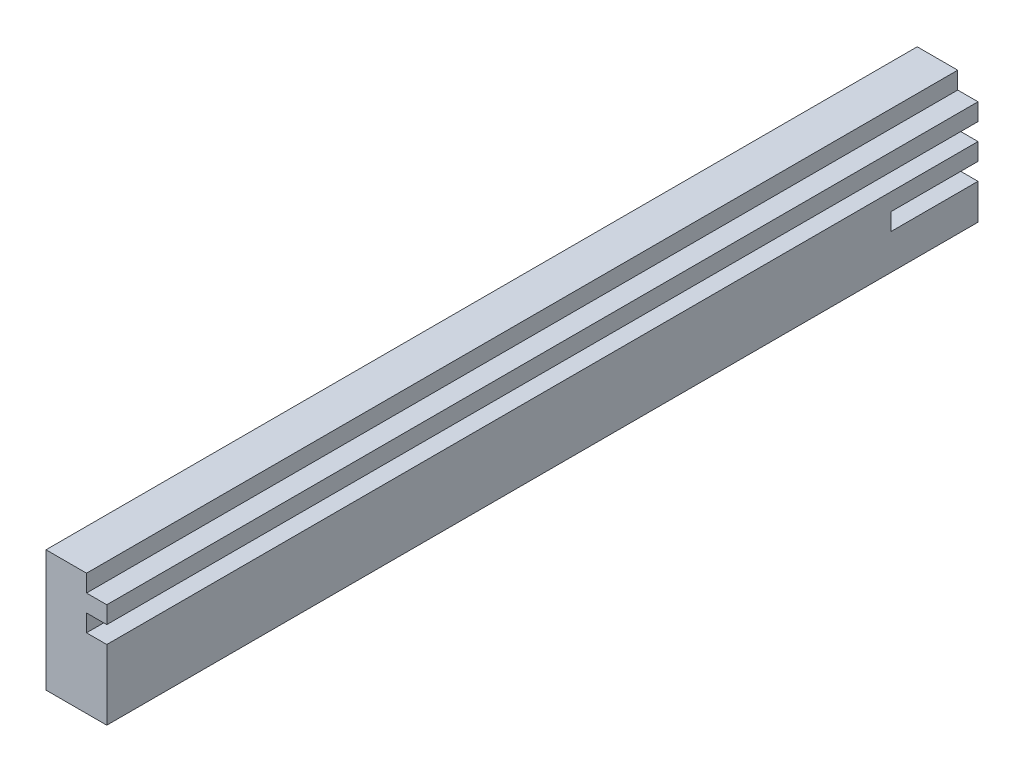
ISO-10303-21;
HEADER;
FILE_DESCRIPTION(('STEP AP214'),'2;1');
FILE_NAME('part.step','',(''),(''),'','','');
FILE_SCHEMA(('AUTOMOTIVE_DESIGN { 1 0 10303 214 1 1 1 1 }'));
ENDSEC;
DATA;
#1=APPLICATION_CONTEXT('core data for automotive mechanical design processes');
#2=APPLICATION_PROTOCOL_DEFINITION('international standard','automotive_design',2000,#1);
#3=PRODUCT_CONTEXT('',#1,'mechanical');
#4=PRODUCT('Part','Part','',(#3));
#5=PRODUCT_RELATED_PRODUCT_CATEGORY('part','',(#4));
#6=PRODUCT_DEFINITION_FORMATION('','',#4);
#7=PRODUCT_DEFINITION_CONTEXT('part definition',#1,'design');
#8=PRODUCT_DEFINITION('design','',#6,#7);
#9=PRODUCT_DEFINITION_SHAPE('','',#8);
#10=(LENGTH_UNIT() NAMED_UNIT(*) SI_UNIT(.MILLI.,.METRE.));
#11=(NAMED_UNIT(*) PLANE_ANGLE_UNIT() SI_UNIT($,.RADIAN.));
#12=(NAMED_UNIT(*) SI_UNIT($,.STERADIAN.) SOLID_ANGLE_UNIT());
#13=UNCERTAINTY_MEASURE_WITH_UNIT(LENGTH_MEASURE(1.E-05),#10,'distance_accuracy_value','');
#14=(GEOMETRIC_REPRESENTATION_CONTEXT(3) GLOBAL_UNCERTAINTY_ASSIGNED_CONTEXT((#13)) GLOBAL_UNIT_ASSIGNED_CONTEXT((#10,
#11,#12)) REPRESENTATION_CONTEXT('',''));
#15=CARTESIAN_POINT('',(0.,0.,0.));
#16=DIRECTION('',(0.,0.,1.));
#17=DIRECTION('',(1.,0.,0.));
#18=AXIS2_PLACEMENT_3D('',#15,#16,#17);
#19=CARTESIAN_POINT('',(30.,0.,-430.));
#20=DIRECTION('',(0.,0.,1.));
#21=DIRECTION('',(1.,0.,0.));
#22=AXIS2_PLACEMENT_3D('',#19,#20,#21);
#23=PLANE('',#22);
#24=DIRECTION('',(0.,-1.,0.));
#25=VECTOR('',#24,1.);
#26=CARTESIAN_POINT('',(20.,60.,-430.));
#27=LINE('',#26,#25);
#28=CARTESIAN_POINT('',(20.,60.,-430.));
#29=VERTEX_POINT('',#28);
#30=CARTESIAN_POINT('',(20.,51.5,-430.));
#31=VERTEX_POINT('',#30);
#32=EDGE_CURVE('E151',#29,#31,#27,.T.);
#33=ORIENTED_EDGE('',*,*,#32,.T.);
#34=DIRECTION('',(1.,0.,0.));
#35=VECTOR('',#34,1.);
#36=CARTESIAN_POINT('',(20.,51.5,-430.));
#37=LINE('',#36,#35);
#38=CARTESIAN_POINT('',(30.,51.5,-430.));
#39=VERTEX_POINT('',#38);
#40=EDGE_CURVE('E135',#31,#39,#37,.T.);
#41=ORIENTED_EDGE('',*,*,#40,.T.);
#42=DIRECTION('',(0.,1.,0.));
#43=VECTOR('',#42,1.);
#44=CARTESIAN_POINT('',(30.,0.,-430.));
#45=LINE('',#44,#43);
#46=CARTESIAN_POINT('',(30.,43.,-430.));
#47=VERTEX_POINT('',#46);
#48=EDGE_CURVE('E224',#47,#39,#45,.T.);
#49=ORIENTED_EDGE('',*,*,#48,.F.);
#50=DIRECTION('',(1.,0.,0.));
#51=VECTOR('',#50,1.);
#52=CARTESIAN_POINT('',(20.,43.,-430.));
#53=LINE('',#52,#51);
#54=CARTESIAN_POINT('',(20.,43.,-430.));
#55=VERTEX_POINT('',#54);
#56=EDGE_CURVE('E48',#55,#47,#53,.T.);
#57=ORIENTED_EDGE('',*,*,#56,.F.);
#58=DIRECTION('',(0.,-1.,0.));
#59=VECTOR('',#58,1.);
#60=CARTESIAN_POINT('',(20.,43.,-430.));
#61=LINE('',#60,#59);
#62=CARTESIAN_POINT('',(20.,34.5,-430.));
#63=VERTEX_POINT('',#62);
#64=EDGE_CURVE('E187',#55,#63,#61,.T.);
#65=ORIENTED_EDGE('',*,*,#64,.T.);
#66=DIRECTION('',(1.,0.,0.));
#67=VECTOR('',#66,1.);
#68=CARTESIAN_POINT('',(20.,34.5,-430.));
#69=LINE('',#68,#67);
#70=CARTESIAN_POINT('',(30.,34.5,-430.));
#71=VERTEX_POINT('',#70);
#72=EDGE_CURVE('E168',#63,#71,#69,.T.);
#73=ORIENTED_EDGE('',*,*,#72,.T.);
#74=CARTESIAN_POINT('',(30.,26.,-430.));
#75=VERTEX_POINT('',#74);
#76=EDGE_CURVE('E229',#75,#71,#45,.T.);
#77=ORIENTED_EDGE('',*,*,#76,.F.);
#78=DIRECTION('',(1.,0.,0.));
#79=VECTOR('',#78,1.);
#80=CARTESIAN_POINT('',(20.,26.,-430.));
#81=LINE('',#80,#79);
#82=CARTESIAN_POINT('',(20.,26.,-430.));
#83=VERTEX_POINT('',#82);
#84=EDGE_CURVE('E56',#83,#75,#81,.T.);
#85=ORIENTED_EDGE('',*,*,#84,.F.);
#86=DIRECTION('',(0.,-1.,0.));
#87=VECTOR('',#86,1.);
#88=CARTESIAN_POINT('',(20.,26.,-430.));
#89=LINE('',#88,#87);
#90=CARTESIAN_POINT('',(20.,17.5,-430.));
#91=VERTEX_POINT('',#90);
#92=EDGE_CURVE('E200',#83,#91,#89,.T.);
#93=ORIENTED_EDGE('',*,*,#92,.T.);
#94=DIRECTION('',(1.,0.,0.));
#95=VECTOR('',#94,1.);
#96=CARTESIAN_POINT('',(20.,17.5,-430.));
#97=LINE('',#96,#95);
#98=CARTESIAN_POINT('',(30.,17.5,-430.));
#99=VERTEX_POINT('',#98);
#100=EDGE_CURVE('E197',#91,#99,#97,.T.);
#101=ORIENTED_EDGE('',*,*,#100,.T.);
#102=CARTESIAN_POINT('',(30.,0.,-430.));
#103=VERTEX_POINT('',#102);
#104=EDGE_CURVE('E225',#103,#99,#45,.T.);
#105=ORIENTED_EDGE('',*,*,#104,.F.);
#106=DIRECTION('',(-1.,0.,0.));
#107=VECTOR('',#106,1.);
#108=CARTESIAN_POINT('',(30.,0.,-430.));
#109=LINE('',#108,#107);
#110=CARTESIAN_POINT('',(0.,0.,-430.));
#111=VERTEX_POINT('',#110);
#112=EDGE_CURVE('E41',#103,#111,#109,.T.);
#113=ORIENTED_EDGE('',*,*,#112,.T.);
#114=DIRECTION('',(0.,1.,0.));
#115=VECTOR('',#114,1.);
#116=CARTESIAN_POINT('',(0.,0.,-430.));
#117=LINE('',#116,#115);
#118=CARTESIAN_POINT('',(0.,60.,-430.));
#119=VERTEX_POINT('',#118);
#120=EDGE_CURVE('E234',#111,#119,#117,.T.);
#121=ORIENTED_EDGE('',*,*,#120,.T.);
#122=DIRECTION('',(-1.,0.,0.));
#123=VECTOR('',#122,1.);
#124=CARTESIAN_POINT('',(30.,60.,-430.));
#125=LINE('',#124,#123);
#126=EDGE_CURVE('E158',#29,#119,#125,.T.);
#127=ORIENTED_EDGE('',*,*,#126,.F.);
#128=EDGE_LOOP('',(#33,#41,#49,#57,#65,#73,#77,#85,#93,#101,#105,#113,#121,#127));
#129=FACE_BOUND('',#128,.T.);
#130=ADVANCED_FACE('F33',(#129),#23,.F.);
#131=CARTESIAN_POINT('',(30.,0.,0.));
#132=DIRECTION('',(-1.,0.,0.));
#133=DIRECTION('',(0.,0.,1.));
#134=AXIS2_PLACEMENT_3D('',#131,#132,#133);
#135=PLANE('',#134);
#136=ORIENTED_EDGE('',*,*,#48,.T.);
#137=DIRECTION('',(0.,0.,-1.));
#138=VECTOR('',#137,1.);
#139=CARTESIAN_POINT('',(30.,51.5,0.));
#140=LINE('',#139,#138);
#141=CARTESIAN_POINT('',(30.,51.5,0.));
#142=VERTEX_POINT('',#141);
#143=EDGE_CURVE('E141',#142,#39,#140,.T.);
#144=ORIENTED_EDGE('',*,*,#143,.F.);
#145=DIRECTION('',(0.,-1.,0.));
#146=VECTOR('',#145,1.);
#147=CARTESIAN_POINT('',(30.,0.,0.));
#148=LINE('',#147,#146);
#149=CARTESIAN_POINT('',(30.,43.,0.));
#150=VERTEX_POINT('',#149);
#151=EDGE_CURVE('E220',#142,#150,#148,.T.);
#152=ORIENTED_EDGE('',*,*,#151,.T.);
#153=DIRECTION('',(0.,0.,-1.));
#154=VECTOR('',#153,1.);
#155=CARTESIAN_POINT('',(30.,43.,0.));
#156=LINE('',#155,#154);
#157=EDGE_CURVE('E179',#150,#47,#156,.T.);
#158=ORIENTED_EDGE('',*,*,#157,.T.);
#159=EDGE_LOOP('',(#136,#144,#152,#158));
#160=FACE_BOUND('',#159,.T.);
#161=ADVANCED_FACE('F256',(#160),#135,.F.);
#162=ORIENTED_EDGE('',*,*,#76,.T.);
#163=DIRECTION('',(0.,0.,-1.));
#164=VECTOR('',#163,1.);
#165=CARTESIAN_POINT('',(30.,34.5,0.));
#166=LINE('',#165,#164);
#167=CARTESIAN_POINT('',(30.,34.5,0.));
#168=VERTEX_POINT('',#167);
#169=EDGE_CURVE('E165',#168,#71,#166,.T.);
#170=ORIENTED_EDGE('',*,*,#169,.F.);
#171=CARTESIAN_POINT('',(30.,0.,0.));
#172=VERTEX_POINT('',#171);
#173=EDGE_CURVE('E218',#168,#172,#148,.T.);
#174=ORIENTED_EDGE('',*,*,#173,.T.);
#175=DIRECTION('',(0.,0.,-1.));
#176=VECTOR('',#175,1.);
#177=CARTESIAN_POINT('',(30.,0.,0.));
#178=LINE('',#177,#176);
#179=EDGE_CURVE('E222',#172,#103,#178,.T.);
#180=ORIENTED_EDGE('',*,*,#179,.T.);
#181=ORIENTED_EDGE('',*,*,#104,.T.);
#182=DIRECTION('',(0.,0.,1.));
#183=VECTOR('',#182,1.);
#184=CARTESIAN_POINT('',(30.,17.5,-430.));
#185=LINE('',#184,#183);
#186=CARTESIAN_POINT('',(30.,17.5,-387.111548622784));
#187=VERTEX_POINT('',#186);
#188=EDGE_CURVE('E178',#99,#187,#185,.T.);
#189=ORIENTED_EDGE('',*,*,#188,.T.);
#190=DIRECTION('',(0.,-1.,0.));
#191=VECTOR('',#190,1.);
#192=CARTESIAN_POINT('',(30.,26.,-387.111548622784));
#193=LINE('',#192,#191);
#194=CARTESIAN_POINT('',(30.,26.,-387.111548622784));
#195=VERTEX_POINT('',#194);
#196=EDGE_CURVE('E203',#195,#187,#193,.T.);
#197=ORIENTED_EDGE('',*,*,#196,.F.);
#198=DIRECTION('',(0.,0.,1.));
#199=VECTOR('',#198,1.);
#200=CARTESIAN_POINT('',(30.,26.,-430.));
#201=LINE('',#200,#199);
#202=EDGE_CURVE('E201',#75,#195,#201,.T.);
#203=ORIENTED_EDGE('',*,*,#202,.F.);
#204=EDGE_LOOP('',(#162,#170,#174,#180,#181,#189,#197,#203));
#205=FACE_BOUND('',#204,.T.);
#206=ADVANCED_FACE('F261',(#205),#135,.F.);
#207=CARTESIAN_POINT('',(30.,0.,0.));
#208=DIRECTION('',(0.,0.,-1.));
#209=DIRECTION('',(0.,1.,0.));
#210=AXIS2_PLACEMENT_3D('',#207,#208,#209);
#211=PLANE('',#210);
#212=ORIENTED_EDGE('',*,*,#151,.F.);
#213=DIRECTION('',(1.,0.,0.));
#214=VECTOR('',#213,1.);
#215=CARTESIAN_POINT('',(20.,51.5,0.));
#216=LINE('',#215,#214);
#217=CARTESIAN_POINT('',(20.,51.5,0.));
#218=VERTEX_POINT('',#217);
#219=EDGE_CURVE('E146',#218,#142,#216,.T.);
#220=ORIENTED_EDGE('',*,*,#219,.F.);
#221=DIRECTION('',(0.,-1.,0.));
#222=VECTOR('',#221,1.);
#223=CARTESIAN_POINT('',(20.,60.,0.));
#224=LINE('',#223,#222);
#225=CARTESIAN_POINT('',(20.,60.,0.));
#226=VERTEX_POINT('',#225);
#227=EDGE_CURVE('E147',#226,#218,#224,.T.);
#228=ORIENTED_EDGE('',*,*,#227,.F.);
#229=DIRECTION('',(-1.,0.,0.));
#230=VECTOR('',#229,1.);
#231=CARTESIAN_POINT('',(30.,60.,0.));
#232=LINE('',#231,#230);
#233=CARTESIAN_POINT('',(0.,60.,0.));
#234=VERTEX_POINT('',#233);
#235=EDGE_CURVE('E228',#226,#234,#232,.T.);
#236=ORIENTED_EDGE('',*,*,#235,.T.);
#237=DIRECTION('',(0.,-1.,0.));
#238=VECTOR('',#237,1.);
#239=CARTESIAN_POINT('',(0.,0.,0.));
#240=LINE('',#239,#238);
#241=CARTESIAN_POINT('',(0.,0.,0.));
#242=VERTEX_POINT('',#241);
#243=EDGE_CURVE('E166',#234,#242,#240,.T.);
#244=ORIENTED_EDGE('',*,*,#243,.T.);
#245=DIRECTION('',(-1.,0.,0.));
#246=VECTOR('',#245,1.);
#247=CARTESIAN_POINT('',(30.,0.,0.));
#248=LINE('',#247,#246);
#249=EDGE_CURVE('E11',#172,#242,#248,.T.);
#250=ORIENTED_EDGE('',*,*,#249,.F.);
#251=ORIENTED_EDGE('',*,*,#173,.F.);
#252=DIRECTION('',(1.,0.,0.));
#253=VECTOR('',#252,1.);
#254=CARTESIAN_POINT('',(20.,34.5,0.));
#255=LINE('',#254,#253);
#256=CARTESIAN_POINT('',(20.,34.5,0.));
#257=VERTEX_POINT('',#256);
#258=EDGE_CURVE('E176',#257,#168,#255,.T.);
#259=ORIENTED_EDGE('',*,*,#258,.F.);
#260=DIRECTION('',(0.,-1.,0.));
#261=VECTOR('',#260,1.);
#262=CARTESIAN_POINT('',(20.,43.,0.));
#263=LINE('',#262,#261);
#264=CARTESIAN_POINT('',(20.,43.,0.));
#265=VERTEX_POINT('',#264);
#266=EDGE_CURVE('E171',#265,#257,#263,.T.);
#267=ORIENTED_EDGE('',*,*,#266,.F.);
#268=DIRECTION('',(1.,0.,0.));
#269=VECTOR('',#268,1.);
#270=CARTESIAN_POINT('',(20.,43.,0.));
#271=LINE('',#270,#269);
#272=EDGE_CURVE('E173',#265,#150,#271,.T.);
#273=ORIENTED_EDGE('',*,*,#272,.T.);
#274=EDGE_LOOP('',(#212,#220,#228,#236,#244,#250,#251,#259,#267,#273));
#275=FACE_BOUND('',#274,.T.);
#276=ADVANCED_FACE('F35',(#275),#211,.F.);
#277=CARTESIAN_POINT('',(30.,0.,0.));
#278=DIRECTION('',(0.,1.,0.));
#279=DIRECTION('',(0.,0.,1.));
#280=AXIS2_PLACEMENT_3D('',#277,#278,#279);
#281=PLANE('',#280);
#282=DIRECTION('',(0.,0.,-1.));
#283=VECTOR('',#282,1.);
#284=CARTESIAN_POINT('',(0.,0.,0.));
#285=LINE('',#284,#283);
#286=EDGE_CURVE('E232',#242,#111,#285,.T.);
#287=ORIENTED_EDGE('',*,*,#286,.T.);
#288=ORIENTED_EDGE('',*,*,#112,.F.);
#289=ORIENTED_EDGE('',*,*,#179,.F.);
#290=ORIENTED_EDGE('',*,*,#249,.T.);
#291=EDGE_LOOP('',(#287,#288,#289,#290));
#292=FACE_BOUND('',#291,.T.);
#293=ADVANCED_FACE('F273',(#292),#281,.F.);
#294=CARTESIAN_POINT('',(30.,60.,0.));
#295=DIRECTION('',(0.,-1.,0.));
#296=DIRECTION('',(0.,0.,-1.));
#297=AXIS2_PLACEMENT_3D('',#294,#295,#296);
#298=PLANE('',#297);
#299=ORIENTED_EDGE('',*,*,#235,.F.);
#300=DIRECTION('',(0.,0.,-1.));
#301=VECTOR('',#300,1.);
#302=CARTESIAN_POINT('',(20.,60.,0.));
#303=LINE('',#302,#301);
#304=EDGE_CURVE('E159',#226,#29,#303,.T.);
#305=ORIENTED_EDGE('',*,*,#304,.T.);
#306=ORIENTED_EDGE('',*,*,#126,.T.);
#307=DIRECTION('',(0.,0.,1.));
#308=VECTOR('',#307,1.);
#309=CARTESIAN_POINT('',(0.,60.,0.));
#310=LINE('',#309,#308);
#311=EDGE_CURVE('E221',#119,#234,#310,.T.);
#312=ORIENTED_EDGE('',*,*,#311,.T.);
#313=EDGE_LOOP('',(#299,#305,#306,#312));
#314=FACE_BOUND('',#313,.T.);
#315=ADVANCED_FACE('F251',(#314),#298,.F.);
#316=CARTESIAN_POINT('',(0.,0.,0.));
#317=DIRECTION('',(-1.,0.,0.));
#318=DIRECTION('',(0.,0.,1.));
#319=AXIS2_PLACEMENT_3D('',#316,#317,#318);
#320=PLANE('',#319);
#321=ORIENTED_EDGE('',*,*,#243,.F.);
#322=ORIENTED_EDGE('',*,*,#311,.F.);
#323=ORIENTED_EDGE('',*,*,#120,.F.);
#324=ORIENTED_EDGE('',*,*,#286,.F.);
#325=EDGE_LOOP('',(#321,#322,#323,#324));
#326=FACE_BOUND('',#325,.T.);
#327=ADVANCED_FACE('F248',(#326),#320,.T.);
#328=CARTESIAN_POINT('',(20.,17.5,-430.));
#329=DIRECTION('',(0.,1.,0.));
#330=DIRECTION('',(0.,0.,1.));
#331=AXIS2_PLACEMENT_3D('',#328,#329,#330);
#332=PLANE('',#331);
#333=ORIENTED_EDGE('',*,*,#188,.F.);
#334=ORIENTED_EDGE('',*,*,#100,.F.);
#335=DIRECTION('',(0.,0.,1.));
#336=VECTOR('',#335,1.);
#337=CARTESIAN_POINT('',(20.,17.5,-430.));
#338=LINE('',#337,#336);
#339=CARTESIAN_POINT('',(20.,17.5,-387.111548622784));
#340=VERTEX_POINT('',#339);
#341=EDGE_CURVE('E204',#91,#340,#338,.T.);
#342=ORIENTED_EDGE('',*,*,#341,.T.);
#343=DIRECTION('',(1.,0.,0.));
#344=VECTOR('',#343,1.);
#345=CARTESIAN_POINT('',(20.,17.5,-387.111548622784));
#346=LINE('',#345,#344);
#347=EDGE_CURVE('E192',#340,#187,#346,.T.);
#348=ORIENTED_EDGE('',*,*,#347,.T.);
#349=EDGE_LOOP('',(#333,#334,#342,#348));
#350=FACE_BOUND('',#349,.T.);
#351=ADVANCED_FACE('F288',(#350),#332,.T.);
#352=CARTESIAN_POINT('',(20.,26.,-387.111548622784));
#353=DIRECTION('',(0.,0.,1.));
#354=DIRECTION('',(1.,0.,0.));
#355=AXIS2_PLACEMENT_3D('',#352,#353,#354);
#356=PLANE('',#355);
#357=ORIENTED_EDGE('',*,*,#196,.T.);
#358=ORIENTED_EDGE('',*,*,#347,.F.);
#359=DIRECTION('',(0.,-1.,0.));
#360=VECTOR('',#359,1.);
#361=CARTESIAN_POINT('',(20.,26.,-387.111548622784));
#362=LINE('',#361,#360);
#363=CARTESIAN_POINT('',(20.,26.,-387.111548622784));
#364=VERTEX_POINT('',#363);
#365=EDGE_CURVE('E214',#364,#340,#362,.T.);
#366=ORIENTED_EDGE('',*,*,#365,.F.);
#367=DIRECTION('',(1.,0.,0.));
#368=VECTOR('',#367,1.);
#369=CARTESIAN_POINT('',(20.,26.,-387.111548622784));
#370=LINE('',#369,#368);
#371=EDGE_CURVE('E194',#364,#195,#370,.T.);
#372=ORIENTED_EDGE('',*,*,#371,.T.);
#373=EDGE_LOOP('',(#357,#358,#366,#372));
#374=FACE_BOUND('',#373,.T.);
#375=ADVANCED_FACE('F297',(#374),#356,.F.);
#376=CARTESIAN_POINT('',(20.,26.,-430.));
#377=DIRECTION('',(0.,1.,0.));
#378=DIRECTION('',(0.,0.,1.));
#379=AXIS2_PLACEMENT_3D('',#376,#377,#378);
#380=PLANE('',#379);
#381=ORIENTED_EDGE('',*,*,#202,.T.);
#382=ORIENTED_EDGE('',*,*,#371,.F.);
#383=DIRECTION('',(0.,0.,1.));
#384=VECTOR('',#383,1.);
#385=CARTESIAN_POINT('',(20.,26.,-430.));
#386=LINE('',#385,#384);
#387=EDGE_CURVE('E211',#83,#364,#386,.T.);
#388=ORIENTED_EDGE('',*,*,#387,.F.);
#389=ORIENTED_EDGE('',*,*,#84,.T.);
#390=EDGE_LOOP('',(#381,#382,#388,#389));
#391=FACE_BOUND('',#390,.T.);
#392=ADVANCED_FACE('F293',(#391),#380,.F.);
#393=CARTESIAN_POINT('',(20.,0.,0.));
#394=DIRECTION('',(1.,0.,0.));
#395=DIRECTION('',(0.,0.,-1.));
#396=AXIS2_PLACEMENT_3D('',#393,#394,#395);
#397=PLANE('',#396);
#398=ORIENTED_EDGE('',*,*,#341,.F.);
#399=ORIENTED_EDGE('',*,*,#92,.F.);
#400=ORIENTED_EDGE('',*,*,#387,.T.);
#401=ORIENTED_EDGE('',*,*,#365,.T.);
#402=EDGE_LOOP('',(#398,#399,#400,#401));
#403=FACE_BOUND('',#402,.T.);
#404=ADVANCED_FACE('F290',(#403),#397,.T.);
#405=CARTESIAN_POINT('',(20.,34.5,0.));
#406=DIRECTION('',(0.,-1.,0.));
#407=DIRECTION('',(0.,0.,-1.));
#408=AXIS2_PLACEMENT_3D('',#405,#406,#407);
#409=PLANE('',#408);
#410=ORIENTED_EDGE('',*,*,#169,.T.);
#411=ORIENTED_EDGE('',*,*,#72,.F.);
#412=DIRECTION('',(0.,0.,-1.));
#413=VECTOR('',#412,1.);
#414=CARTESIAN_POINT('',(20.,34.5,0.));
#415=LINE('',#414,#413);
#416=EDGE_CURVE('E181',#257,#63,#415,.T.);
#417=ORIENTED_EDGE('',*,*,#416,.F.);
#418=ORIENTED_EDGE('',*,*,#258,.T.);
#419=EDGE_LOOP('',(#410,#411,#417,#418));
#420=FACE_BOUND('',#419,.T.);
#421=ADVANCED_FACE('F266',(#420),#409,.F.);
#422=CARTESIAN_POINT('',(20.,43.,0.));
#423=DIRECTION('',(0.,-1.,0.));
#424=DIRECTION('',(0.,0.,-1.));
#425=AXIS2_PLACEMENT_3D('',#422,#423,#424);
#426=PLANE('',#425);
#427=ORIENTED_EDGE('',*,*,#157,.F.);
#428=ORIENTED_EDGE('',*,*,#272,.F.);
#429=DIRECTION('',(0.,0.,-1.));
#430=VECTOR('',#429,1.);
#431=CARTESIAN_POINT('',(20.,43.,0.));
#432=LINE('',#431,#430);
#433=EDGE_CURVE('E185',#265,#55,#432,.T.);
#434=ORIENTED_EDGE('',*,*,#433,.T.);
#435=ORIENTED_EDGE('',*,*,#56,.T.);
#436=EDGE_LOOP('',(#427,#428,#434,#435));
#437=FACE_BOUND('',#436,.T.);
#438=ADVANCED_FACE('F306',(#437),#426,.T.);
#439=CARTESIAN_POINT('',(20.,0.,0.));
#440=DIRECTION('',(-1.,0.,0.));
#441=DIRECTION('',(0.,0.,1.));
#442=AXIS2_PLACEMENT_3D('',#439,#440,#441);
#443=PLANE('',#442);
#444=ORIENTED_EDGE('',*,*,#416,.T.);
#445=ORIENTED_EDGE('',*,*,#64,.F.);
#446=ORIENTED_EDGE('',*,*,#433,.F.);
#447=ORIENTED_EDGE('',*,*,#266,.T.);
#448=EDGE_LOOP('',(#444,#445,#446,#447));
#449=FACE_BOUND('',#448,.T.);
#450=ADVANCED_FACE('F268',(#449),#443,.F.);
#451=CARTESIAN_POINT('',(20.,51.5,0.));
#452=DIRECTION('',(0.,-1.,0.));
#453=DIRECTION('',(0.,0.,-1.));
#454=AXIS2_PLACEMENT_3D('',#451,#452,#453);
#455=PLANE('',#454);
#456=ORIENTED_EDGE('',*,*,#143,.T.);
#457=ORIENTED_EDGE('',*,*,#40,.F.);
#458=DIRECTION('',(0.,0.,-1.));
#459=VECTOR('',#458,1.);
#460=CARTESIAN_POINT('',(20.,51.5,0.));
#461=LINE('',#460,#459);
#462=EDGE_CURVE('E138',#218,#31,#461,.T.);
#463=ORIENTED_EDGE('',*,*,#462,.F.);
#464=ORIENTED_EDGE('',*,*,#219,.T.);
#465=EDGE_LOOP('',(#456,#457,#463,#464));
#466=FACE_BOUND('',#465,.T.);
#467=ADVANCED_FACE('F137',(#466),#455,.F.);
#468=CARTESIAN_POINT('',(20.,0.,0.));
#469=DIRECTION('',(-1.,0.,0.));
#470=DIRECTION('',(0.,0.,1.));
#471=AXIS2_PLACEMENT_3D('',#468,#469,#470);
#472=PLANE('',#471);
#473=ORIENTED_EDGE('',*,*,#462,.T.);
#474=ORIENTED_EDGE('',*,*,#32,.F.);
#475=ORIENTED_EDGE('',*,*,#304,.F.);
#476=ORIENTED_EDGE('',*,*,#227,.T.);
#477=EDGE_LOOP('',(#473,#474,#475,#476));
#478=FACE_BOUND('',#477,.T.);
#479=ADVANCED_FACE('F150',(#478),#472,.F.);
#480=CLOSED_SHELL('',(#130,#161,#206,#276,#293,#315,#327,#351,#375,#392,#404,#421,#438,#450,
#467,#479));
#481=MANIFOLD_SOLID_BREP('B2',#480);
#482=ADVANCED_BREP_SHAPE_REPRESENTATION('',(#18,#481),#14);
#483=SHAPE_DEFINITION_REPRESENTATION(#9,#482);
ENDSEC;
END-ISO-10303-21;
